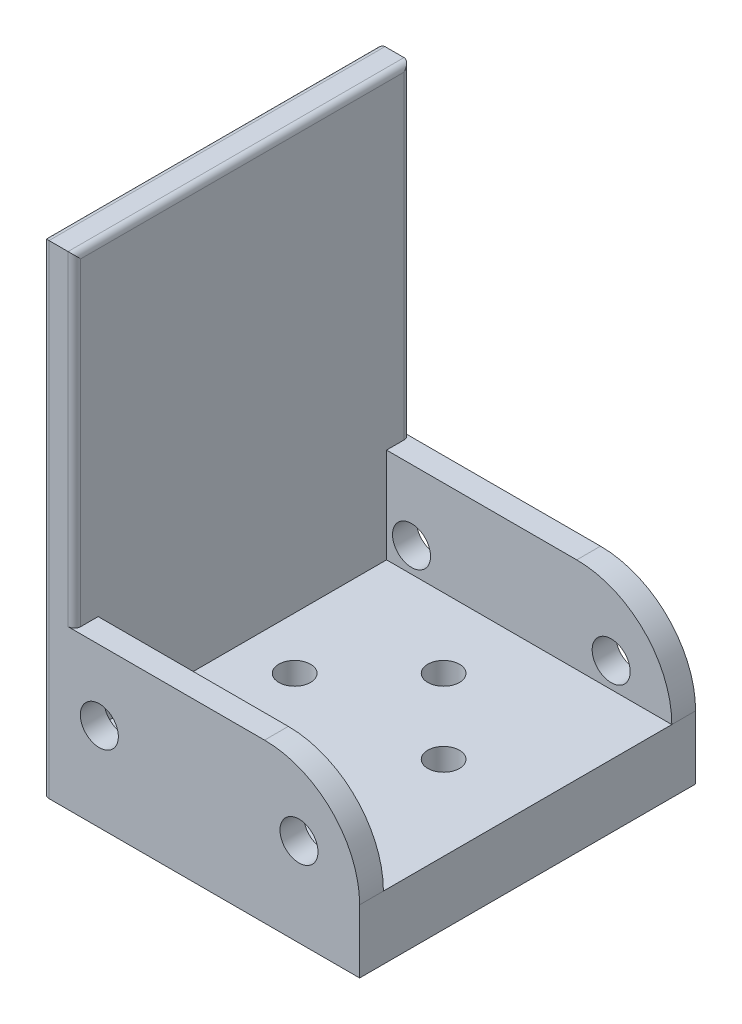
ISO-10303-21;
HEADER;
FILE_DESCRIPTION(('STEP AP214'),'2;1');
FILE_NAME('part.step','',(''),(''),'','','');
FILE_SCHEMA(('AUTOMOTIVE_DESIGN { 1 0 10303 214 1 1 1 1 }'));
ENDSEC;
DATA;
#1=APPLICATION_CONTEXT('core data for automotive mechanical design processes');
#2=APPLICATION_PROTOCOL_DEFINITION('international standard','automotive_design',2000,#1);
#3=PRODUCT_CONTEXT('',#1,'mechanical');
#4=PRODUCT('Part','Part','',(#3));
#5=PRODUCT_RELATED_PRODUCT_CATEGORY('part','',(#4));
#6=PRODUCT_DEFINITION_FORMATION('','',#4);
#7=PRODUCT_DEFINITION_CONTEXT('part definition',#1,'design');
#8=PRODUCT_DEFINITION('design','',#6,#7);
#9=PRODUCT_DEFINITION_SHAPE('','',#8);
#10=(LENGTH_UNIT() NAMED_UNIT(*) SI_UNIT(.MILLI.,.METRE.));
#11=(NAMED_UNIT(*) PLANE_ANGLE_UNIT() SI_UNIT($,.RADIAN.));
#12=(NAMED_UNIT(*) SI_UNIT($,.STERADIAN.) SOLID_ANGLE_UNIT());
#13=UNCERTAINTY_MEASURE_WITH_UNIT(LENGTH_MEASURE(1.E-05),#10,'distance_accuracy_value','');
#14=(GEOMETRIC_REPRESENTATION_CONTEXT(3) GLOBAL_UNCERTAINTY_ASSIGNED_CONTEXT((#13)) GLOBAL_UNIT_ASSIGNED_CONTEXT((#10,
#11,#12)) REPRESENTATION_CONTEXT('',''));
#15=CARTESIAN_POINT('',(0.,0.,0.));
#16=DIRECTION('',(0.,0.,1.));
#17=DIRECTION('',(1.,0.,0.));
#18=AXIS2_PLACEMENT_3D('',#15,#16,#17);
#19=CARTESIAN_POINT('',(0.,5.08,0.));
#20=DIRECTION('',(0.,-1.,0.));
#21=DIRECTION('',(0.,0.,-1.));
#22=AXIS2_PLACEMENT_3D('',#19,#20,#21);
#23=PLANE('',#22);
#24=CARTESIAN_POINT('',(-5.969,5.08,0.));
#25=DIRECTION('',(0.,-1.,0.));
#26=DIRECTION('',(0.,0.,-1.));
#27=AXIS2_PLACEMENT_3D('',#24,#25,#26);
#28=CIRCLE('',#27,1.27);
#29=CARTESIAN_POINT('',(-5.969,5.08,-1.27));
#30=VERTEX_POINT('',#29);
#31=EDGE_CURVE('E325',#30,#30,#28,.T.);
#32=ORIENTED_EDGE('',*,*,#31,.T.);
#33=EDGE_LOOP('',(#32));
#34=FACE_BOUND('',#33,.T.);
#35=CARTESIAN_POINT('',(0.,5.08,5.969));
#36=DIRECTION('',(0.,-1.,0.));
#37=DIRECTION('',(0.,0.,-1.));
#38=AXIS2_PLACEMENT_3D('',#35,#36,#37);
#39=CIRCLE('',#38,1.27);
#40=CARTESIAN_POINT('',(0.,5.08,4.699));
#41=VERTEX_POINT('',#40);
#42=EDGE_CURVE('E321',#41,#41,#39,.T.);
#43=ORIENTED_EDGE('',*,*,#42,.T.);
#44=EDGE_LOOP('',(#43));
#45=FACE_BOUND('',#44,.T.);
#46=CARTESIAN_POINT('',(0.,5.08,-5.969));
#47=DIRECTION('',(0.,-1.,0.));
#48=DIRECTION('',(0.,0.,-1.));
#49=AXIS2_PLACEMENT_3D('',#46,#47,#48);
#50=CIRCLE('',#49,1.27);
#51=CARTESIAN_POINT('',(0.,5.08,-7.239));
#52=VERTEX_POINT('',#51);
#53=EDGE_CURVE('E317',#52,#52,#50,.T.);
#54=ORIENTED_EDGE('',*,*,#53,.T.);
#55=EDGE_LOOP('',(#54));
#56=FACE_BOUND('',#55,.T.);
#57=CARTESIAN_POINT('',(5.96899999999999,5.08,0.));
#58=DIRECTION('',(0.,-1.,0.));
#59=DIRECTION('',(0.,0.,-1.));
#60=AXIS2_PLACEMENT_3D('',#57,#58,#59);
#61=CIRCLE('',#60,1.27);
#62=CARTESIAN_POINT('',(5.96899999999999,5.08,-1.27));
#63=VERTEX_POINT('',#62);
#64=EDGE_CURVE('E302',#63,#63,#61,.T.);
#65=ORIENTED_EDGE('',*,*,#64,.T.);
#66=EDGE_LOOP('',(#65));
#67=FACE_BOUND('',#66,.T.);
#68=DIRECTION('',(1.,0.,0.));
#69=VECTOR('',#68,1.);
#70=CARTESIAN_POINT('',(-12.7,5.08,-11.557));
#71=LINE('',#70,#69);
#72=CARTESIAN_POINT('',(-10.16,5.08,-11.557));
#73=VERTEX_POINT('',#72);
#74=CARTESIAN_POINT('',(12.7,5.08,-11.557));
#75=VERTEX_POINT('',#74);
#76=EDGE_CURVE('E157',#73,#75,#71,.T.);
#77=ORIENTED_EDGE('',*,*,#76,.F.);
#78=DIRECTION('',(0.,0.,1.));
#79=VECTOR('',#78,1.);
#80=CARTESIAN_POINT('',(-10.16,5.08,0.));
#81=LINE('',#80,#79);
#82=CARTESIAN_POINT('',(-10.16,5.08,11.557));
#83=VERTEX_POINT('',#82);
#84=EDGE_CURVE('E341',#73,#83,#81,.T.);
#85=ORIENTED_EDGE('',*,*,#84,.T.);
#86=DIRECTION('',(-1.,0.,0.));
#87=VECTOR('',#86,1.);
#88=CARTESIAN_POINT('',(-12.7,5.08,11.557));
#89=LINE('',#88,#87);
#90=CARTESIAN_POINT('',(12.7,5.08,11.557));
#91=VERTEX_POINT('',#90);
#92=EDGE_CURVE('E171',#91,#83,#89,.T.);
#93=ORIENTED_EDGE('',*,*,#92,.F.);
#94=DIRECTION('',(0.,0.,-1.));
#95=VECTOR('',#94,1.);
#96=CARTESIAN_POINT('',(12.7,5.08,13.462));
#97=LINE('',#96,#95);
#98=EDGE_CURVE('E179',#91,#75,#97,.T.);
#99=ORIENTED_EDGE('',*,*,#98,.T.);
#100=EDGE_LOOP('',(#77,#85,#93,#99));
#101=FACE_BOUND('',#100,.T.);
#102=ADVANCED_FACE('F45',(#34,#45,#56,#67,#101),#23,.F.);
#103=CARTESIAN_POINT('',(12.7,5.08,13.462));
#104=DIRECTION('',(-1.,0.,0.));
#105=DIRECTION('',(0.,0.,1.));
#106=AXIS2_PLACEMENT_3D('',#103,#104,#105);
#107=PLANE('',#106);
#108=ORIENTED_EDGE('',*,*,#98,.F.);
#109=DIRECTION('',(0.,0.,-1.));
#110=VECTOR('',#109,1.);
#111=CARTESIAN_POINT('',(12.7,5.08,13.462));
#112=LINE('',#111,#110);
#113=CARTESIAN_POINT('',(12.7,5.08,13.462));
#114=VERTEX_POINT('',#113);
#115=EDGE_CURVE('E185',#91,#114,#112,.F.);
#116=ORIENTED_EDGE('',*,*,#115,.T.);
#117=DIRECTION('',(0.,-1.,0.));
#118=VECTOR('',#117,1.);
#119=CARTESIAN_POINT('',(12.7,5.08,13.462));
#120=LINE('',#119,#118);
#121=CARTESIAN_POINT('',(12.7,0.,13.462));
#122=VERTEX_POINT('',#121);
#123=EDGE_CURVE('E191',#114,#122,#120,.T.);
#124=ORIENTED_EDGE('',*,*,#123,.T.);
#125=DIRECTION('',(0.,0.,-1.));
#126=VECTOR('',#125,1.);
#127=CARTESIAN_POINT('',(12.7,0.,13.462));
#128=LINE('',#127,#126);
#129=CARTESIAN_POINT('',(12.7,0.,-13.462));
#130=VERTEX_POINT('',#129);
#131=EDGE_CURVE('E362',#122,#130,#128,.T.);
#132=ORIENTED_EDGE('',*,*,#131,.T.);
#133=DIRECTION('',(0.,-1.,0.));
#134=VECTOR('',#133,1.);
#135=CARTESIAN_POINT('',(12.7,5.08,-13.462));
#136=LINE('',#135,#134);
#137=CARTESIAN_POINT('',(12.7,5.08,-13.462));
#138=VERTEX_POINT('',#137);
#139=EDGE_CURVE('E182',#138,#130,#136,.T.);
#140=ORIENTED_EDGE('',*,*,#139,.F.);
#141=DIRECTION('',(0.,0.,-1.));
#142=VECTOR('',#141,1.);
#143=CARTESIAN_POINT('',(12.7,5.08,-11.557));
#144=LINE('',#143,#142);
#145=EDGE_CURVE('E177',#138,#75,#144,.F.);
#146=ORIENTED_EDGE('',*,*,#145,.T.);
#147=EDGE_LOOP('',(#108,#116,#124,#132,#140,#146));
#148=FACE_BOUND('',#147,.T.);
#149=ADVANCED_FACE('F178',(#148),#107,.F.);
#150=CARTESIAN_POINT('',(-12.7,5.08,-13.462));
#151=DIRECTION('',(0.,0.,1.));
#152=DIRECTION('',(1.,0.,0.));
#153=AXIS2_PLACEMENT_3D('',#150,#151,#152);
#154=PLANE('',#153);
#155=CARTESIAN_POINT('',(7.84,7.08,-13.462));
#156=DIRECTION('',(0.,0.,-1.));
#157=DIRECTION('',(-1.,0.,0.));
#158=AXIS2_PLACEMENT_3D('',#155,#156,#157);
#159=CIRCLE('',#158,1.524);
#160=CARTESIAN_POINT('',(6.316,7.08,-13.462));
#161=VERTEX_POINT('',#160);
#162=EDGE_CURVE('E279',#161,#161,#159,.T.);
#163=ORIENTED_EDGE('',*,*,#162,.F.);
#164=EDGE_LOOP('',(#163));
#165=FACE_BOUND('',#164,.T.);
#166=CARTESIAN_POINT('',(-8.16,7.08,-13.462));
#167=DIRECTION('',(0.,0.,-1.));
#168=DIRECTION('',(-1.,0.,0.));
#169=AXIS2_PLACEMENT_3D('',#166,#167,#168);
#170=CIRCLE('',#169,1.524);
#171=CARTESIAN_POINT('',(-9.684,7.08,-13.462));
#172=VERTEX_POINT('',#171);
#173=EDGE_CURVE('E291',#172,#172,#170,.T.);
#174=ORIENTED_EDGE('',*,*,#173,.F.);
#175=EDGE_LOOP('',(#174));
#176=FACE_BOUND('',#175,.T.);
#177=DIRECTION('',(-1.,0.,0.));
#178=VECTOR('',#177,1.);
#179=CARTESIAN_POINT('',(-12.7,0.,-13.462));
#180=LINE('',#179,#178);
#181=CARTESIAN_POINT('',(-12.192,0.,-13.462));
#182=VERTEX_POINT('',#181);
#183=EDGE_CURVE('E366',#130,#182,#180,.T.);
#184=ORIENTED_EDGE('',*,*,#183,.T.);
#185=DIRECTION('',(0.,-1.,0.));
#186=VECTOR('',#185,1.);
#187=CARTESIAN_POINT('',(-12.192,5.08,-13.462));
#188=LINE('',#187,#186);
#189=CARTESIAN_POINT('',(-12.192,38.735,-13.462));
#190=VERTEX_POINT('',#189);
#191=EDGE_CURVE('E246',#182,#190,#188,.F.);
#192=ORIENTED_EDGE('',*,*,#191,.T.);
#193=DIRECTION('',(-1.,0.,0.));
#194=VECTOR('',#193,1.);
#195=CARTESIAN_POINT('',(-10.16,38.735,-13.462));
#196=LINE('',#195,#194);
#197=CARTESIAN_POINT('',(-10.668,38.735,-13.462));
#198=VERTEX_POINT('',#197);
#199=EDGE_CURVE('E330',#198,#190,#196,.T.);
#200=ORIENTED_EDGE('',*,*,#199,.F.);
#201=DIRECTION('',(0.,-1.,0.));
#202=VECTOR('',#201,1.);
#203=CARTESIAN_POINT('',(-10.668,12.7,-13.462));
#204=LINE('',#203,#202);
#205=CARTESIAN_POINT('',(-10.668,12.7,-13.462));
#206=VERTEX_POINT('',#205);
#207=EDGE_CURVE('E243',#198,#206,#204,.T.);
#208=ORIENTED_EDGE('',*,*,#207,.T.);
#209=DIRECTION('',(-1.,0.,0.));
#210=VECTOR('',#209,1.);
#211=CARTESIAN_POINT('',(-12.7,12.7,-13.462));
#212=LINE('',#211,#210);
#213=CARTESIAN_POINT('',(5.08,12.7,-13.462));
#214=VERTEX_POINT('',#213);
#215=EDGE_CURVE('E62',#214,#206,#212,.T.);
#216=ORIENTED_EDGE('',*,*,#215,.F.);
#217=CARTESIAN_POINT('',(5.08,5.08,-13.462));
#218=DIRECTION('',(0.,0.,1.));
#219=DIRECTION('',(1.,0.,0.));
#220=AXIS2_PLACEMENT_3D('',#217,#218,#219);
#221=CIRCLE('',#220,7.62);
#222=EDGE_CURVE('E198',#214,#138,#221,.F.);
#223=ORIENTED_EDGE('',*,*,#222,.T.);
#224=ORIENTED_EDGE('',*,*,#139,.T.);
#225=EDGE_LOOP('',(#184,#192,#200,#208,#216,#223,#224));
#226=FACE_BOUND('',#225,.T.);
#227=ADVANCED_FACE('F394',(#165,#176,#226),#154,.F.);
#228=CARTESIAN_POINT('',(-12.7,5.08,13.462));
#229=DIRECTION('',(1.,0.,0.));
#230=DIRECTION('',(0.,0.,-1.));
#231=AXIS2_PLACEMENT_3D('',#228,#229,#230);
#232=PLANE('',#231);
#233=DIRECTION('',(0.,0.,1.));
#234=VECTOR('',#233,1.);
#235=CARTESIAN_POINT('',(-12.7,0.,13.462));
#236=LINE('',#235,#234);
#237=CARTESIAN_POINT('',(-12.7,0.,-12.954));
#238=VERTEX_POINT('',#237);
#239=CARTESIAN_POINT('',(-12.7,0.,12.954));
#240=VERTEX_POINT('',#239);
#241=EDGE_CURVE('E369',#238,#240,#236,.T.);
#242=ORIENTED_EDGE('',*,*,#241,.T.);
#243=DIRECTION('',(0.,-1.,0.));
#244=VECTOR('',#243,1.);
#245=CARTESIAN_POINT('',(-12.7,5.08,12.954));
#246=LINE('',#245,#244);
#247=CARTESIAN_POINT('',(-12.7,38.227,12.954));
#248=VERTEX_POINT('',#247);
#249=EDGE_CURVE('E229',#240,#248,#246,.F.);
#250=ORIENTED_EDGE('',*,*,#249,.T.);
#251=DIRECTION('',(0.,0.,-1.));
#252=VECTOR('',#251,1.);
#253=CARTESIAN_POINT('',(-12.7,38.227,-13.462));
#254=LINE('',#253,#252);
#255=CARTESIAN_POINT('',(-12.7,38.227,-12.954));
#256=VERTEX_POINT('',#255);
#257=EDGE_CURVE('E225',#248,#256,#254,.T.);
#258=ORIENTED_EDGE('',*,*,#257,.T.);
#259=DIRECTION('',(0.,-1.,0.));
#260=VECTOR('',#259,1.);
#261=CARTESIAN_POINT('',(-12.7,5.08,-12.954));
#262=LINE('',#261,#260);
#263=EDGE_CURVE('E222',#256,#238,#262,.T.);
#264=ORIENTED_EDGE('',*,*,#263,.T.);
#265=EDGE_LOOP('',(#242,#250,#258,#264));
#266=FACE_BOUND('',#265,.T.);
#267=ADVANCED_FACE('F443',(#266),#232,.F.);
#268=CARTESIAN_POINT('',(-12.7,5.08,13.462));
#269=DIRECTION('',(0.,0.,-1.));
#270=DIRECTION('',(-1.,0.,0.));
#271=AXIS2_PLACEMENT_3D('',#268,#269,#270);
#272=PLANE('',#271);
#273=CARTESIAN_POINT('',(7.84,7.08,13.462));
#274=DIRECTION('',(0.,0.,-1.));
#275=DIRECTION('',(-1.,0.,0.));
#276=AXIS2_PLACEMENT_3D('',#273,#274,#275);
#277=CIRCLE('',#276,1.524);
#278=CARTESIAN_POINT('',(6.316,7.08,13.462));
#279=VERTEX_POINT('',#278);
#280=EDGE_CURVE('E271',#279,#279,#277,.T.);
#281=ORIENTED_EDGE('',*,*,#280,.T.);
#282=EDGE_LOOP('',(#281));
#283=FACE_BOUND('',#282,.T.);
#284=CARTESIAN_POINT('',(-8.16,7.08,13.462));
#285=DIRECTION('',(0.,0.,-1.));
#286=DIRECTION('',(-1.,0.,0.));
#287=AXIS2_PLACEMENT_3D('',#284,#285,#286);
#288=CIRCLE('',#287,1.524);
#289=CARTESIAN_POINT('',(-9.684,7.08,13.462));
#290=VERTEX_POINT('',#289);
#291=EDGE_CURVE('E285',#290,#290,#288,.T.);
#292=ORIENTED_EDGE('',*,*,#291,.T.);
#293=EDGE_LOOP('',(#292));
#294=FACE_BOUND('',#293,.T.);
#295=DIRECTION('',(1.,0.,0.));
#296=VECTOR('',#295,1.);
#297=CARTESIAN_POINT('',(-12.7,12.7,13.462));
#298=LINE('',#297,#296);
#299=CARTESIAN_POINT('',(-10.668,12.7,13.462));
#300=VERTEX_POINT('',#299);
#301=CARTESIAN_POINT('',(5.08,12.7,13.462));
#302=VERTEX_POINT('',#301);
#303=EDGE_CURVE('E353',#300,#302,#298,.T.);
#304=ORIENTED_EDGE('',*,*,#303,.F.);
#305=DIRECTION('',(0.,1.,0.));
#306=VECTOR('',#305,1.);
#307=CARTESIAN_POINT('',(-10.668,38.735,13.462));
#308=LINE('',#307,#306);
#309=CARTESIAN_POINT('',(-10.668,38.735,13.462));
#310=VERTEX_POINT('',#309);
#311=EDGE_CURVE('E235',#300,#310,#308,.T.);
#312=ORIENTED_EDGE('',*,*,#311,.T.);
#313=DIRECTION('',(-1.,0.,0.));
#314=VECTOR('',#313,1.);
#315=CARTESIAN_POINT('',(-10.16,38.735,13.462));
#316=LINE('',#315,#314);
#317=CARTESIAN_POINT('',(-12.192,38.735,13.462));
#318=VERTEX_POINT('',#317);
#319=EDGE_CURVE('E329',#310,#318,#316,.T.);
#320=ORIENTED_EDGE('',*,*,#319,.T.);
#321=DIRECTION('',(0.,-1.,0.));
#322=VECTOR('',#321,1.);
#323=CARTESIAN_POINT('',(-12.192,5.08,13.462));
#324=LINE('',#323,#322);
#325=CARTESIAN_POINT('',(-12.192,0.,13.462));
#326=VERTEX_POINT('',#325);
#327=EDGE_CURVE('E232',#318,#326,#324,.T.);
#328=ORIENTED_EDGE('',*,*,#327,.T.);
#329=DIRECTION('',(1.,0.,0.));
#330=VECTOR('',#329,1.);
#331=CARTESIAN_POINT('',(-12.7,0.,13.462));
#332=LINE('',#331,#330);
#333=EDGE_CURVE('E192',#326,#122,#332,.T.);
#334=ORIENTED_EDGE('',*,*,#333,.T.);
#335=ORIENTED_EDGE('',*,*,#123,.F.);
#336=CARTESIAN_POINT('',(5.08,5.08,13.462));
#337=DIRECTION('',(0.,0.,-1.));
#338=DIRECTION('',(-1.,0.,0.));
#339=AXIS2_PLACEMENT_3D('',#336,#337,#338);
#340=CIRCLE('',#339,7.62);
#341=EDGE_CURVE('E388',#114,#302,#340,.F.);
#342=ORIENTED_EDGE('',*,*,#341,.T.);
#343=EDGE_LOOP('',(#304,#312,#320,#328,#334,#335,#342));
#344=FACE_BOUND('',#343,.T.);
#345=ADVANCED_FACE('F420',(#283,#294,#344),#272,.F.);
#346=CARTESIAN_POINT('',(0.,0.,0.));
#347=DIRECTION('',(0.,-1.,0.));
#348=DIRECTION('',(0.,0.,-1.));
#349=AXIS2_PLACEMENT_3D('',#346,#347,#348);
#350=PLANE('',#349);
#351=CARTESIAN_POINT('',(-5.969,0.,0.));
#352=DIRECTION('',(0.,-1.,0.));
#353=DIRECTION('',(0.,0.,-1.));
#354=AXIS2_PLACEMENT_3D('',#351,#352,#353);
#355=CIRCLE('',#354,1.27);
#356=CARTESIAN_POINT('',(-5.969,0.,-1.27));
#357=VERTEX_POINT('',#356);
#358=EDGE_CURVE('E298',#357,#357,#355,.T.);
#359=ORIENTED_EDGE('',*,*,#358,.F.);
#360=EDGE_LOOP('',(#359));
#361=FACE_BOUND('',#360,.T.);
#362=CARTESIAN_POINT('',(0.,0.,5.969));
#363=DIRECTION('',(0.,-1.,0.));
#364=DIRECTION('',(0.,0.,-1.));
#365=AXIS2_PLACEMENT_3D('',#362,#363,#364);
#366=CIRCLE('',#365,1.27);
#367=CARTESIAN_POINT('',(0.,0.,4.699));
#368=VERTEX_POINT('',#367);
#369=EDGE_CURVE('E303',#368,#368,#366,.T.);
#370=ORIENTED_EDGE('',*,*,#369,.F.);
#371=EDGE_LOOP('',(#370));
#372=FACE_BOUND('',#371,.T.);
#373=CARTESIAN_POINT('',(0.,0.,-5.969));
#374=DIRECTION('',(0.,-1.,0.));
#375=DIRECTION('',(0.,0.,-1.));
#376=AXIS2_PLACEMENT_3D('',#373,#374,#375);
#377=CIRCLE('',#376,1.27);
#378=CARTESIAN_POINT('',(0.,0.,-7.239));
#379=VERTEX_POINT('',#378);
#380=EDGE_CURVE('E307',#379,#379,#377,.T.);
#381=ORIENTED_EDGE('',*,*,#380,.F.);
#382=EDGE_LOOP('',(#381));
#383=FACE_BOUND('',#382,.T.);
#384=CARTESIAN_POINT('',(5.96899999999999,0.,0.));
#385=DIRECTION('',(0.,-1.,0.));
#386=DIRECTION('',(0.,0.,-1.));
#387=AXIS2_PLACEMENT_3D('',#384,#385,#386);
#388=CIRCLE('',#387,1.27);
#389=CARTESIAN_POINT('',(5.96899999999999,0.,-1.27));
#390=VERTEX_POINT('',#389);
#391=EDGE_CURVE('E260',#390,#390,#388,.T.);
#392=ORIENTED_EDGE('',*,*,#391,.F.);
#393=EDGE_LOOP('',(#392));
#394=FACE_BOUND('',#393,.T.);
#395=ORIENTED_EDGE('',*,*,#333,.F.);
#396=CARTESIAN_POINT('',(-12.192,0.,12.954));
#397=DIRECTION('',(0.,-1.,0.));
#398=DIRECTION('',(0.,0.,-1.));
#399=AXIS2_PLACEMENT_3D('',#396,#397,#398);
#400=CIRCLE('',#399,0.508);
#401=EDGE_CURVE('E240',#326,#240,#400,.T.);
#402=ORIENTED_EDGE('',*,*,#401,.T.);
#403=ORIENTED_EDGE('',*,*,#241,.F.);
#404=CARTESIAN_POINT('',(-12.192,0.,-12.954));
#405=DIRECTION('',(0.,-1.,0.));
#406=DIRECTION('',(0.,0.,-1.));
#407=AXIS2_PLACEMENT_3D('',#404,#405,#406);
#408=CIRCLE('',#407,0.508);
#409=EDGE_CURVE('E70',#238,#182,#408,.T.);
#410=ORIENTED_EDGE('',*,*,#409,.T.);
#411=ORIENTED_EDGE('',*,*,#183,.F.);
#412=ORIENTED_EDGE('',*,*,#131,.F.);
#413=EDGE_LOOP('',(#395,#402,#403,#410,#411,#412));
#414=FACE_BOUND('',#413,.T.);
#415=ADVANCED_FACE('F423',(#361,#372,#383,#394,#414),#350,.T.);
#416=CARTESIAN_POINT('',(-12.7,12.7,-11.557));
#417=DIRECTION('',(0.,0.,-1.));
#418=DIRECTION('',(-1.,0.,0.));
#419=AXIS2_PLACEMENT_3D('',#416,#417,#418);
#420=PLANE('',#419);
#421=CARTESIAN_POINT('',(7.84,7.08,-11.557));
#422=DIRECTION('',(0.,0.,-1.));
#423=DIRECTION('',(-1.,0.,0.));
#424=AXIS2_PLACEMENT_3D('',#421,#422,#423);
#425=CIRCLE('',#424,1.524);
#426=CARTESIAN_POINT('',(6.316,7.08,-11.557));
#427=VERTEX_POINT('',#426);
#428=EDGE_CURVE('E264',#427,#427,#425,.T.);
#429=ORIENTED_EDGE('',*,*,#428,.T.);
#430=EDGE_LOOP('',(#429));
#431=FACE_BOUND('',#430,.T.);
#432=CARTESIAN_POINT('',(-8.16,7.08,-11.557));
#433=DIRECTION('',(0.,0.,-1.));
#434=DIRECTION('',(-1.,0.,0.));
#435=AXIS2_PLACEMENT_3D('',#432,#433,#434);
#436=CIRCLE('',#435,1.524);
#437=CARTESIAN_POINT('',(-9.684,7.08,-11.557));
#438=VERTEX_POINT('',#437);
#439=EDGE_CURVE('E270',#438,#438,#436,.T.);
#440=ORIENTED_EDGE('',*,*,#439,.T.);
#441=EDGE_LOOP('',(#440));
#442=FACE_BOUND('',#441,.T.);
#443=DIRECTION('',(1.,0.,0.));
#444=VECTOR('',#443,1.);
#445=CARTESIAN_POINT('',(-12.7,12.7,-11.557));
#446=LINE('',#445,#444);
#447=CARTESIAN_POINT('',(-10.16,12.7,-11.557));
#448=VERTEX_POINT('',#447);
#449=CARTESIAN_POINT('',(5.08,12.7,-11.557));
#450=VERTEX_POINT('',#449);
#451=EDGE_CURVE('E170',#448,#450,#446,.T.);
#452=ORIENTED_EDGE('',*,*,#451,.F.);
#453=DIRECTION('',(0.,-1.,0.));
#454=VECTOR('',#453,1.);
#455=CARTESIAN_POINT('',(-10.16,12.7,-11.557));
#456=LINE('',#455,#454);
#457=EDGE_CURVE('E165',#448,#73,#456,.T.);
#458=ORIENTED_EDGE('',*,*,#457,.T.);
#459=ORIENTED_EDGE('',*,*,#76,.T.);
#460=CARTESIAN_POINT('',(5.08,5.08,-11.557));
#461=DIRECTION('',(0.,0.,-1.));
#462=DIRECTION('',(-1.,0.,0.));
#463=AXIS2_PLACEMENT_3D('',#460,#461,#462);
#464=CIRCLE('',#463,7.62);
#465=EDGE_CURVE('E162',#75,#450,#464,.F.);
#466=ORIENTED_EDGE('',*,*,#465,.T.);
#467=EDGE_LOOP('',(#452,#458,#459,#466));
#468=FACE_BOUND('',#467,.T.);
#469=ADVANCED_FACE('F160',(#431,#442,#468),#420,.F.);
#470=CARTESIAN_POINT('',(0.,12.7,0.));
#471=DIRECTION('',(0.,1.,0.));
#472=DIRECTION('',(0.,0.,1.));
#473=AXIS2_PLACEMENT_3D('',#470,#471,#472);
#474=PLANE('',#473);
#475=DIRECTION('',(0.,0.,-1.));
#476=VECTOR('',#475,1.);
#477=CARTESIAN_POINT('',(-10.16,12.7,0.));
#478=LINE('',#477,#476);
#479=CARTESIAN_POINT('',(-10.16,12.7,-12.954));
#480=VERTEX_POINT('',#479);
#481=EDGE_CURVE('E346',#448,#480,#478,.T.);
#482=ORIENTED_EDGE('',*,*,#481,.F.);
#483=ORIENTED_EDGE('',*,*,#451,.T.);
#484=DIRECTION('',(0.,0.,-1.));
#485=VECTOR('',#484,1.);
#486=CARTESIAN_POINT('',(5.08,12.7,-13.462));
#487=LINE('',#486,#485);
#488=EDGE_CURVE('E195',#450,#214,#487,.T.);
#489=ORIENTED_EDGE('',*,*,#488,.T.);
#490=ORIENTED_EDGE('',*,*,#215,.T.);
#491=CARTESIAN_POINT('',(-10.668,12.7,-12.954));
#492=DIRECTION('',(0.,1.,0.));
#493=DIRECTION('',(0.,0.,1.));
#494=AXIS2_PLACEMENT_3D('',#491,#492,#493);
#495=CIRCLE('',#494,0.508);
#496=EDGE_CURVE('E11',#206,#480,#495,.F.);
#497=ORIENTED_EDGE('',*,*,#496,.T.);
#498=EDGE_LOOP('',(#482,#483,#489,#490,#497));
#499=FACE_BOUND('',#498,.T.);
#500=ADVANCED_FACE('F392',(#499),#474,.T.);
#501=CARTESIAN_POINT('',(-12.7,12.7,11.557));
#502=DIRECTION('',(0.,0.,1.));
#503=DIRECTION('',(1.,0.,0.));
#504=AXIS2_PLACEMENT_3D('',#501,#502,#503);
#505=PLANE('',#504);
#506=CARTESIAN_POINT('',(7.84,7.08,11.557));
#507=DIRECTION('',(0.,0.,1.));
#508=DIRECTION('',(1.,0.,0.));
#509=AXIS2_PLACEMENT_3D('',#506,#507,#508);
#510=CIRCLE('',#509,1.524);
#511=CARTESIAN_POINT('',(9.364,7.08,11.557));
#512=VERTEX_POINT('',#511);
#513=EDGE_CURVE('E49',#512,#512,#510,.T.);
#514=ORIENTED_EDGE('',*,*,#513,.T.);
#515=EDGE_LOOP('',(#514));
#516=FACE_BOUND('',#515,.T.);
#517=CARTESIAN_POINT('',(-8.16,7.08,11.557));
#518=DIRECTION('',(0.,0.,1.));
#519=DIRECTION('',(1.,0.,0.));
#520=AXIS2_PLACEMENT_3D('',#517,#518,#519);
#521=CIRCLE('',#520,1.524);
#522=CARTESIAN_POINT('',(-6.636,7.08,11.557));
#523=VERTEX_POINT('',#522);
#524=EDGE_CURVE('E267',#523,#523,#521,.T.);
#525=ORIENTED_EDGE('',*,*,#524,.T.);
#526=EDGE_LOOP('',(#525));
#527=FACE_BOUND('',#526,.T.);
#528=ORIENTED_EDGE('',*,*,#92,.T.);
#529=DIRECTION('',(0.,1.,0.));
#530=VECTOR('',#529,1.);
#531=CARTESIAN_POINT('',(-10.16,12.7,11.557));
#532=LINE('',#531,#530);
#533=CARTESIAN_POINT('',(-10.16,12.7,11.557));
#534=VERTEX_POINT('',#533);
#535=EDGE_CURVE('E334',#83,#534,#532,.T.);
#536=ORIENTED_EDGE('',*,*,#535,.T.);
#537=DIRECTION('',(-1.,0.,0.));
#538=VECTOR('',#537,1.);
#539=CARTESIAN_POINT('',(-12.7,12.7,11.557));
#540=LINE('',#539,#538);
#541=CARTESIAN_POINT('',(5.08,12.7,11.557));
#542=VERTEX_POINT('',#541);
#543=EDGE_CURVE('E350',#542,#534,#540,.T.);
#544=ORIENTED_EDGE('',*,*,#543,.F.);
#545=CARTESIAN_POINT('',(5.08,5.08,11.557));
#546=DIRECTION('',(0.,0.,1.));
#547=DIRECTION('',(1.,0.,0.));
#548=AXIS2_PLACEMENT_3D('',#545,#546,#547);
#549=CIRCLE('',#548,7.62);
#550=EDGE_CURVE('E186',#542,#91,#549,.F.);
#551=ORIENTED_EDGE('',*,*,#550,.T.);
#552=EDGE_LOOP('',(#528,#536,#544,#551));
#553=FACE_BOUND('',#552,.T.);
#554=ADVANCED_FACE('F407',(#516,#527,#553),#505,.F.);
#555=CARTESIAN_POINT('',(0.,12.7,0.));
#556=DIRECTION('',(0.,1.,0.));
#557=DIRECTION('',(0.,0.,1.));
#558=AXIS2_PLACEMENT_3D('',#555,#556,#557);
#559=PLANE('',#558);
#560=DIRECTION('',(0.,0.,-1.));
#561=VECTOR('',#560,1.);
#562=CARTESIAN_POINT('',(-10.16,12.7,0.));
#563=LINE('',#562,#561);
#564=CARTESIAN_POINT('',(-10.16,12.7,12.954));
#565=VERTEX_POINT('',#564);
#566=EDGE_CURVE('E197',#565,#534,#563,.T.);
#567=ORIENTED_EDGE('',*,*,#566,.F.);
#568=CARTESIAN_POINT('',(-10.668,12.7,12.954));
#569=DIRECTION('',(0.,1.,0.));
#570=DIRECTION('',(0.,0.,1.));
#571=AXIS2_PLACEMENT_3D('',#568,#569,#570);
#572=CIRCLE('',#571,0.508);
#573=EDGE_CURVE('E55',#565,#300,#572,.F.);
#574=ORIENTED_EDGE('',*,*,#573,.T.);
#575=ORIENTED_EDGE('',*,*,#303,.T.);
#576=DIRECTION('',(0.,0.,-1.));
#577=VECTOR('',#576,1.);
#578=CARTESIAN_POINT('',(5.08,12.7,11.557));
#579=LINE('',#578,#577);
#580=EDGE_CURVE('E380',#302,#542,#579,.T.);
#581=ORIENTED_EDGE('',*,*,#580,.T.);
#582=ORIENTED_EDGE('',*,*,#543,.T.);
#583=EDGE_LOOP('',(#567,#574,#575,#581,#582));
#584=FACE_BOUND('',#583,.T.);
#585=ADVANCED_FACE('F415',(#584),#559,.T.);
#586=CARTESIAN_POINT('',(5.08,5.08,0.));
#587=DIRECTION('',(0.,0.,1.));
#588=DIRECTION('',(1.,0.,0.));
#589=AXIS2_PLACEMENT_3D('',#586,#587,#588);
#590=CYLINDRICAL_SURFACE('',#589,7.62);
#591=ORIENTED_EDGE('',*,*,#341,.F.);
#592=ORIENTED_EDGE('',*,*,#115,.F.);
#593=ORIENTED_EDGE('',*,*,#550,.F.);
#594=ORIENTED_EDGE('',*,*,#580,.F.);
#595=EDGE_LOOP('',(#591,#592,#593,#594));
#596=FACE_BOUND('',#595,.T.);
#597=ADVANCED_FACE('F412',(#596),#590,.T.);
#598=CARTESIAN_POINT('',(5.08,5.08,0.));
#599=DIRECTION('',(0.,0.,1.));
#600=DIRECTION('',(1.,0.,0.));
#601=AXIS2_PLACEMENT_3D('',#598,#599,#600);
#602=CYLINDRICAL_SURFACE('',#601,7.62);
#603=ORIENTED_EDGE('',*,*,#465,.F.);
#604=ORIENTED_EDGE('',*,*,#145,.F.);
#605=ORIENTED_EDGE('',*,*,#222,.F.);
#606=ORIENTED_EDGE('',*,*,#488,.F.);
#607=EDGE_LOOP('',(#603,#604,#605,#606));
#608=FACE_BOUND('',#607,.T.);
#609=ADVANCED_FACE('F194',(#608),#602,.T.);
#610=CARTESIAN_POINT('',(-10.16,38.735,-13.462));
#611=DIRECTION('',(0.,1.,0.));
#612=DIRECTION('',(0.,0.,1.));
#613=AXIS2_PLACEMENT_3D('',#610,#611,#612);
#614=PLANE('',#613);
#615=ORIENTED_EDGE('',*,*,#319,.F.);
#616=DIRECTION('',(0.,0.,-1.));
#617=VECTOR('',#616,1.);
#618=CARTESIAN_POINT('',(-10.668,38.735,-13.462));
#619=LINE('',#618,#617);
#620=EDGE_CURVE('E209',#310,#198,#619,.T.);
#621=ORIENTED_EDGE('',*,*,#620,.T.);
#622=ORIENTED_EDGE('',*,*,#199,.T.);
#623=DIRECTION('',(0.,0.,-1.));
#624=VECTOR('',#623,1.);
#625=CARTESIAN_POINT('',(-12.192,38.735,13.462));
#626=LINE('',#625,#624);
#627=EDGE_CURVE('E202',#190,#318,#626,.F.);
#628=ORIENTED_EDGE('',*,*,#627,.T.);
#629=EDGE_LOOP('',(#615,#621,#622,#628));
#630=FACE_BOUND('',#629,.T.);
#631=ADVANCED_FACE('F437',(#630),#614,.T.);
#632=CARTESIAN_POINT('',(-10.16,0.,0.));
#633=DIRECTION('',(1.,0.,0.));
#634=DIRECTION('',(0.,0.,-1.));
#635=AXIS2_PLACEMENT_3D('',#632,#633,#634);
#636=PLANE('',#635);
#637=DIRECTION('',(0.,0.,-1.));
#638=VECTOR('',#637,1.);
#639=CARTESIAN_POINT('',(-10.16,38.227,0.));
#640=LINE('',#639,#638);
#641=CARTESIAN_POINT('',(-10.16,38.227,-12.954));
#642=VERTEX_POINT('',#641);
#643=CARTESIAN_POINT('',(-10.16,38.227,12.954));
#644=VERTEX_POINT('',#643);
#645=EDGE_CURVE('E216',#642,#644,#640,.F.);
#646=ORIENTED_EDGE('',*,*,#645,.T.);
#647=DIRECTION('',(0.,1.,0.));
#648=VECTOR('',#647,1.);
#649=CARTESIAN_POINT('',(-10.16,12.7,12.954));
#650=LINE('',#649,#648);
#651=EDGE_CURVE('E219',#644,#565,#650,.F.);
#652=ORIENTED_EDGE('',*,*,#651,.T.);
#653=ORIENTED_EDGE('',*,*,#566,.T.);
#654=ORIENTED_EDGE('',*,*,#535,.F.);
#655=ORIENTED_EDGE('',*,*,#84,.F.);
#656=ORIENTED_EDGE('',*,*,#457,.F.);
#657=ORIENTED_EDGE('',*,*,#481,.T.);
#658=DIRECTION('',(0.,-1.,0.));
#659=VECTOR('',#658,1.);
#660=CARTESIAN_POINT('',(-10.16,38.735,-12.954));
#661=LINE('',#660,#659);
#662=EDGE_CURVE('E213',#480,#642,#661,.F.);
#663=ORIENTED_EDGE('',*,*,#662,.T.);
#664=EDGE_LOOP('',(#646,#652,#653,#654,#655,#656,#657,#663));
#665=FACE_BOUND('',#664,.T.);
#666=ADVANCED_FACE('F403',(#665),#636,.T.);
#667=CARTESIAN_POINT('',(5.96899999999999,38.735,0.));
#668=DIRECTION('',(0.,-1.,0.));
#669=DIRECTION('',(0.,0.,-1.));
#670=AXIS2_PLACEMENT_3D('',#667,#668,#669);
#671=CYLINDRICAL_SURFACE('',#670,1.27);
#672=ORIENTED_EDGE('',*,*,#391,.T.);
#673=EDGE_LOOP('',(#672));
#674=FACE_BOUND('',#673,.T.);
#675=ORIENTED_EDGE('',*,*,#64,.F.);
#676=EDGE_LOOP('',(#675));
#677=FACE_BOUND('',#676,.T.);
#678=ADVANCED_FACE('F482',(#674,#677),#671,.F.);
#679=CARTESIAN_POINT('',(0.,38.735,-5.969));
#680=DIRECTION('',(0.,-1.,0.));
#681=DIRECTION('',(0.,0.,-1.));
#682=AXIS2_PLACEMENT_3D('',#679,#680,#681);
#683=CYLINDRICAL_SURFACE('',#682,1.27);
#684=ORIENTED_EDGE('',*,*,#380,.T.);
#685=EDGE_LOOP('',(#684));
#686=FACE_BOUND('',#685,.T.);
#687=ORIENTED_EDGE('',*,*,#53,.F.);
#688=EDGE_LOOP('',(#687));
#689=FACE_BOUND('',#688,.T.);
#690=ADVANCED_FACE('F484',(#686,#689),#683,.F.);
#691=CARTESIAN_POINT('',(0.,38.735,5.969));
#692=DIRECTION('',(0.,-1.,0.));
#693=DIRECTION('',(0.,0.,-1.));
#694=AXIS2_PLACEMENT_3D('',#691,#692,#693);
#695=CYLINDRICAL_SURFACE('',#694,1.27);
#696=ORIENTED_EDGE('',*,*,#369,.T.);
#697=EDGE_LOOP('',(#696));
#698=FACE_BOUND('',#697,.T.);
#699=ORIENTED_EDGE('',*,*,#42,.F.);
#700=EDGE_LOOP('',(#699));
#701=FACE_BOUND('',#700,.T.);
#702=ADVANCED_FACE('F491',(#698,#701),#695,.F.);
#703=CARTESIAN_POINT('',(-5.969,38.735,0.));
#704=DIRECTION('',(0.,-1.,0.));
#705=DIRECTION('',(0.,0.,-1.));
#706=AXIS2_PLACEMENT_3D('',#703,#704,#705);
#707=CYLINDRICAL_SURFACE('',#706,1.27);
#708=ORIENTED_EDGE('',*,*,#358,.T.);
#709=EDGE_LOOP('',(#708));
#710=FACE_BOUND('',#709,.T.);
#711=ORIENTED_EDGE('',*,*,#31,.F.);
#712=EDGE_LOOP('',(#711));
#713=FACE_BOUND('',#712,.T.);
#714=ADVANCED_FACE('F533',(#710,#713),#707,.F.);
#715=CARTESIAN_POINT('',(-10.668,5.08,12.954));
#716=DIRECTION('',(0.,-1.,0.));
#717=DIRECTION('',(0.,0.,-1.));
#718=AXIS2_PLACEMENT_3D('',#715,#716,#717);
#719=CYLINDRICAL_SURFACE('',#718,0.508);
#720=ORIENTED_EDGE('',*,*,#573,.F.);
#721=ORIENTED_EDGE('',*,*,#651,.F.);
#722=CARTESIAN_POINT('',(-10.668,38.227,12.954));
#723=DIRECTION('',(0.,-0.707106781186547,0.707106781186547));
#724=DIRECTION('',(0.,-0.707106781186547,-0.707106781186547));
#725=AXIS2_PLACEMENT_3D('',#722,#723,#724);
#726=ELLIPSE('',#725,0.718420489685532,0.508);
#727=EDGE_CURVE('E255',#310,#644,#726,.F.);
#728=ORIENTED_EDGE('',*,*,#727,.F.);
#729=ORIENTED_EDGE('',*,*,#311,.F.);
#730=EDGE_LOOP('',(#720,#721,#728,#729));
#731=FACE_BOUND('',#730,.T.);
#732=ADVANCED_FACE('F529',(#731),#719,.T.);
#733=CARTESIAN_POINT('',(-10.668,5.08,-12.954));
#734=DIRECTION('',(0.,1.,0.));
#735=DIRECTION('',(0.,0.,1.));
#736=AXIS2_PLACEMENT_3D('',#733,#734,#735);
#737=CYLINDRICAL_SURFACE('',#736,0.508);
#738=ORIENTED_EDGE('',*,*,#496,.F.);
#739=ORIENTED_EDGE('',*,*,#207,.F.);
#740=CARTESIAN_POINT('',(-10.668,38.227,-12.954));
#741=DIRECTION('',(0.,0.707106781186547,0.707106781186547));
#742=DIRECTION('',(0.,0.707106781186547,-0.707106781186547));
#743=AXIS2_PLACEMENT_3D('',#740,#741,#742);
#744=ELLIPSE('',#743,0.718420489685532,0.508);
#745=EDGE_CURVE('E252',#642,#198,#744,.T.);
#746=ORIENTED_EDGE('',*,*,#745,.F.);
#747=ORIENTED_EDGE('',*,*,#662,.F.);
#748=EDGE_LOOP('',(#738,#739,#746,#747));
#749=FACE_BOUND('',#748,.T.);
#750=ADVANCED_FACE('F401',(#749),#737,.T.);
#751=CARTESIAN_POINT('',(-10.668,38.227,-13.462));
#752=DIRECTION('',(0.,0.,-1.));
#753=DIRECTION('',(-1.,0.,0.));
#754=AXIS2_PLACEMENT_3D('',#751,#752,#753);
#755=CYLINDRICAL_SURFACE('',#754,0.508);
#756=ORIENTED_EDGE('',*,*,#727,.T.);
#757=ORIENTED_EDGE('',*,*,#645,.F.);
#758=ORIENTED_EDGE('',*,*,#745,.T.);
#759=ORIENTED_EDGE('',*,*,#620,.F.);
#760=EDGE_LOOP('',(#756,#757,#758,#759));
#761=FACE_BOUND('',#760,.T.);
#762=ADVANCED_FACE('F543',(#761),#755,.T.);
#763=CARTESIAN_POINT('',(-12.192,5.08,12.954));
#764=DIRECTION('',(0.,-1.,0.));
#765=DIRECTION('',(0.,0.,-1.));
#766=AXIS2_PLACEMENT_3D('',#763,#764,#765);
#767=CYLINDRICAL_SURFACE('',#766,0.508);
#768=ORIENTED_EDGE('',*,*,#401,.F.);
#769=ORIENTED_EDGE('',*,*,#327,.F.);
#770=CARTESIAN_POINT('',(-12.192,38.227,12.954));
#771=DIRECTION('',(0.,-0.707106781186547,0.707106781186547));
#772=DIRECTION('',(0.,-0.707106781186547,-0.707106781186547));
#773=AXIS2_PLACEMENT_3D('',#770,#771,#772);
#774=ELLIPSE('',#773,0.718420489685532,0.508);
#775=EDGE_CURVE('E256',#248,#318,#774,.F.);
#776=ORIENTED_EDGE('',*,*,#775,.F.);
#777=ORIENTED_EDGE('',*,*,#249,.F.);
#778=EDGE_LOOP('',(#768,#769,#776,#777));
#779=FACE_BOUND('',#778,.T.);
#780=ADVANCED_FACE('F47',(#779),#767,.T.);
#781=CARTESIAN_POINT('',(-12.192,5.08,-12.954));
#782=DIRECTION('',(0.,-1.,0.));
#783=DIRECTION('',(0.,0.,-1.));
#784=AXIS2_PLACEMENT_3D('',#781,#782,#783);
#785=CYLINDRICAL_SURFACE('',#784,0.508);
#786=ORIENTED_EDGE('',*,*,#409,.F.);
#787=ORIENTED_EDGE('',*,*,#263,.F.);
#788=CARTESIAN_POINT('',(-12.192,38.227,-12.954));
#789=DIRECTION('',(0.,-0.707106781186547,-0.707106781186547));
#790=DIRECTION('',(0.,-0.707106781186547,0.707106781186547));
#791=AXIS2_PLACEMENT_3D('',#788,#789,#790);
#792=ELLIPSE('',#791,0.718420489685532,0.508);
#793=EDGE_CURVE('E261',#190,#256,#792,.F.);
#794=ORIENTED_EDGE('',*,*,#793,.F.);
#795=ORIENTED_EDGE('',*,*,#191,.F.);
#796=EDGE_LOOP('',(#786,#787,#794,#795));
#797=FACE_BOUND('',#796,.T.);
#798=ADVANCED_FACE('F428',(#797),#785,.T.);
#799=CARTESIAN_POINT('',(-12.192,38.227,13.462));
#800=DIRECTION('',(0.,0.,1.));
#801=DIRECTION('',(1.,0.,0.));
#802=AXIS2_PLACEMENT_3D('',#799,#800,#801);
#803=CYLINDRICAL_SURFACE('',#802,0.508);
#804=ORIENTED_EDGE('',*,*,#775,.T.);
#805=ORIENTED_EDGE('',*,*,#627,.F.);
#806=ORIENTED_EDGE('',*,*,#793,.T.);
#807=ORIENTED_EDGE('',*,*,#257,.F.);
#808=EDGE_LOOP('',(#804,#805,#806,#807));
#809=FACE_BOUND('',#808,.T.);
#810=ADVANCED_FACE('F433',(#809),#803,.T.);
#811=CARTESIAN_POINT('',(-8.16,7.08,13.462));
#812=DIRECTION('',(0.,0.,-1.));
#813=DIRECTION('',(-1.,0.,0.));
#814=AXIS2_PLACEMENT_3D('',#811,#812,#813);
#815=CYLINDRICAL_SURFACE('',#814,1.524);
#816=ORIENTED_EDGE('',*,*,#291,.F.);
#817=EDGE_LOOP('',(#816));
#818=FACE_BOUND('',#817,.T.);
#819=ORIENTED_EDGE('',*,*,#524,.F.);
#820=EDGE_LOOP('',(#819));
#821=FACE_BOUND('',#820,.T.);
#822=ADVANCED_FACE('F570',(#818,#821),#815,.F.);
#823=CARTESIAN_POINT('',(7.84,7.08,13.462));
#824=DIRECTION('',(0.,0.,-1.));
#825=DIRECTION('',(-1.,0.,0.));
#826=AXIS2_PLACEMENT_3D('',#823,#824,#825);
#827=CYLINDRICAL_SURFACE('',#826,1.524);
#828=ORIENTED_EDGE('',*,*,#280,.F.);
#829=EDGE_LOOP('',(#828));
#830=FACE_BOUND('',#829,.T.);
#831=ORIENTED_EDGE('',*,*,#513,.F.);
#832=EDGE_LOOP('',(#831));
#833=FACE_BOUND('',#832,.T.);
#834=ADVANCED_FACE('F598',(#830,#833),#827,.F.);
#835=ORIENTED_EDGE('',*,*,#173,.T.);
#836=EDGE_LOOP('',(#835));
#837=FACE_BOUND('',#836,.T.);
#838=ORIENTED_EDGE('',*,*,#439,.F.);
#839=EDGE_LOOP('',(#838));
#840=FACE_BOUND('',#839,.T.);
#841=ADVANCED_FACE('F601',(#837,#840),#815,.F.);
#842=ORIENTED_EDGE('',*,*,#162,.T.);
#843=EDGE_LOOP('',(#842));
#844=FACE_BOUND('',#843,.T.);
#845=ORIENTED_EDGE('',*,*,#428,.F.);
#846=EDGE_LOOP('',(#845));
#847=FACE_BOUND('',#846,.T.);
#848=ADVANCED_FACE('F610',(#844,#847),#827,.F.);
#849=CLOSED_SHELL('',(#102,#149,#227,#267,#345,#415,#469,#500,#554,#585,#597,#609,#631,#666,
#678,#690,#702,#714,#732,#750,#762,#780,#798,#810,#822,#834,#841,#848));
#850=MANIFOLD_SOLID_BREP('B2',#849);
#851=ADVANCED_BREP_SHAPE_REPRESENTATION('',(#18,#850),#14);
#852=SHAPE_DEFINITION_REPRESENTATION(#9,#851);
ENDSEC;
END-ISO-10303-21;
